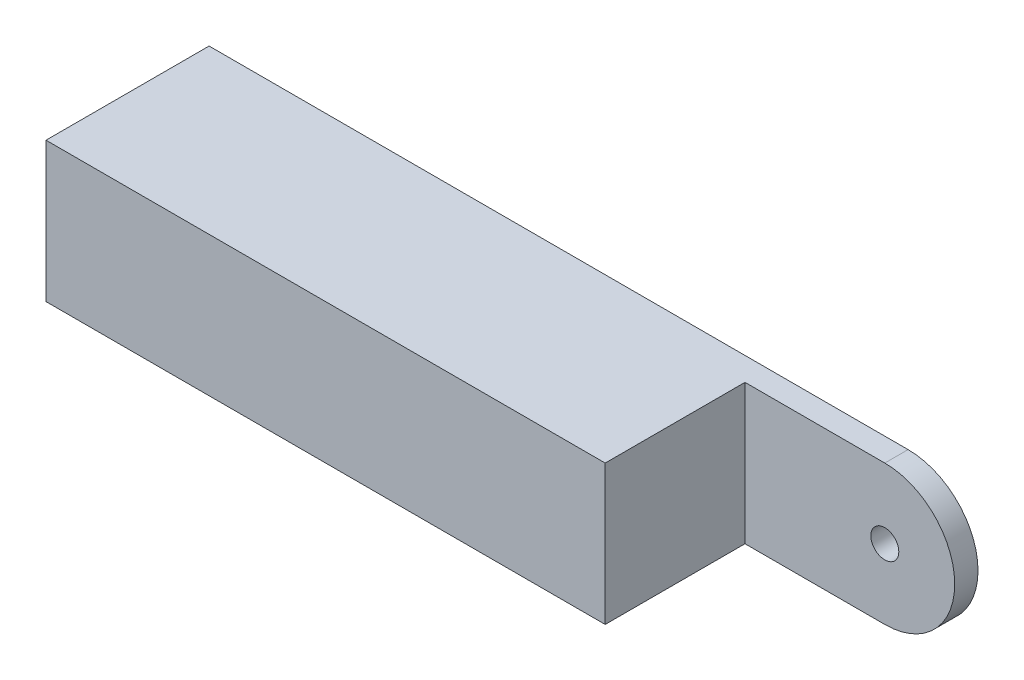
ISO-10303-21;
HEADER;
FILE_DESCRIPTION(('STEP AP214'),'2;1');
FILE_NAME('part.step','',(''),(''),'','','');
FILE_SCHEMA(('AUTOMOTIVE_DESIGN { 1 0 10303 214 1 1 1 1 }'));
ENDSEC;
DATA;
#1=APPLICATION_CONTEXT('core data for automotive mechanical design processes');
#2=APPLICATION_PROTOCOL_DEFINITION('international standard','automotive_design',2000,#1);
#3=PRODUCT_CONTEXT('',#1,'mechanical');
#4=PRODUCT('Part','Part','',(#3));
#5=PRODUCT_RELATED_PRODUCT_CATEGORY('part','',(#4));
#6=PRODUCT_DEFINITION_FORMATION('','',#4);
#7=PRODUCT_DEFINITION_CONTEXT('part definition',#1,'design');
#8=PRODUCT_DEFINITION('design','',#6,#7);
#9=PRODUCT_DEFINITION_SHAPE('','',#8);
#10=(LENGTH_UNIT() NAMED_UNIT(*) SI_UNIT(.MILLI.,.METRE.));
#11=(NAMED_UNIT(*) PLANE_ANGLE_UNIT() SI_UNIT($,.RADIAN.));
#12=(NAMED_UNIT(*) SI_UNIT($,.STERADIAN.) SOLID_ANGLE_UNIT());
#13=UNCERTAINTY_MEASURE_WITH_UNIT(LENGTH_MEASURE(1.E-05),#10,'distance_accuracy_value','');
#14=(GEOMETRIC_REPRESENTATION_CONTEXT(3) GLOBAL_UNCERTAINTY_ASSIGNED_CONTEXT((#13)) GLOBAL_UNIT_ASSIGNED_CONTEXT((#10,
#11,#12)) REPRESENTATION_CONTEXT('',''));
#15=CARTESIAN_POINT('',(0.,0.,0.));
#16=DIRECTION('',(0.,0.,1.));
#17=DIRECTION('',(1.,0.,0.));
#18=AXIS2_PLACEMENT_3D('',#15,#16,#17);
#19=CARTESIAN_POINT('',(-60.,15.,35.));
#20=DIRECTION('',(1.,0.,0.));
#21=DIRECTION('',(0.,0.,-1.));
#22=AXIS2_PLACEMENT_3D('',#19,#20,#21);
#23=PLANE('',#22);
#24=DIRECTION('',(0.,-1.,0.));
#25=VECTOR('',#24,1.);
#26=CARTESIAN_POINT('',(-60.,15.,0.));
#27=LINE('',#26,#25);
#28=CARTESIAN_POINT('',(-60.,15.,0.));
#29=VERTEX_POINT('',#28);
#30=CARTESIAN_POINT('',(-60.,-15.,0.));
#31=VERTEX_POINT('',#30);
#32=EDGE_CURVE('E191',#29,#31,#27,.T.);
#33=ORIENTED_EDGE('',*,*,#32,.T.);
#34=DIRECTION('',(0.,0.,-1.));
#35=VECTOR('',#34,1.);
#36=CARTESIAN_POINT('',(-60.,-15.,35.));
#37=LINE('',#36,#35);
#38=CARTESIAN_POINT('',(-60.,-15.,35.));
#39=VERTEX_POINT('',#38);
#40=EDGE_CURVE('E11',#39,#31,#37,.T.);
#41=ORIENTED_EDGE('',*,*,#40,.F.);
#42=DIRECTION('',(0.,-1.,0.));
#43=VECTOR('',#42,1.);
#44=CARTESIAN_POINT('',(-60.,15.,35.));
#45=LINE('',#44,#43);
#46=CARTESIAN_POINT('',(-60.,15.,35.));
#47=VERTEX_POINT('',#46);
#48=EDGE_CURVE('E198',#47,#39,#45,.T.);
#49=ORIENTED_EDGE('',*,*,#48,.F.);
#50=DIRECTION('',(0.,0.,-1.));
#51=VECTOR('',#50,1.);
#52=CARTESIAN_POINT('',(-60.,15.,35.));
#53=LINE('',#52,#51);
#54=EDGE_CURVE('E208',#47,#29,#53,.T.);
#55=ORIENTED_EDGE('',*,*,#54,.T.);
#56=EDGE_LOOP('',(#33,#41,#49,#55));
#57=FACE_BOUND('',#56,.T.);
#58=ADVANCED_FACE('F38',(#57),#23,.F.);
#59=CARTESIAN_POINT('',(-60.,-15.,35.));
#60=DIRECTION('',(0.,1.,0.));
#61=DIRECTION('',(0.,0.,1.));
#62=AXIS2_PLACEMENT_3D('',#59,#60,#61);
#63=PLANE('',#62);
#64=DIRECTION('',(1.,0.,0.));
#65=VECTOR('',#64,1.);
#66=CARTESIAN_POINT('',(-60.,-15.,0.));
#67=LINE('',#66,#65);
#68=CARTESIAN_POINT('',(90.,-15.,0.));
#69=VERTEX_POINT('',#68);
#70=EDGE_CURVE('E194',#31,#69,#67,.T.);
#71=ORIENTED_EDGE('',*,*,#70,.T.);
#72=DIRECTION('',(0.,0.,-1.));
#73=VECTOR('',#72,1.);
#74=CARTESIAN_POINT('',(90.,-15.,5.));
#75=LINE('',#74,#73);
#76=CARTESIAN_POINT('',(90.,-15.,5.));
#77=VERTEX_POINT('',#76);
#78=EDGE_CURVE('E189',#77,#69,#75,.T.);
#79=ORIENTED_EDGE('',*,*,#78,.F.);
#80=DIRECTION('',(1.,0.,0.));
#81=VECTOR('',#80,1.);
#82=CARTESIAN_POINT('',(0.,-15.,5.));
#83=LINE('',#82,#81);
#84=CARTESIAN_POINT('',(60.,-15.,5.));
#85=VERTEX_POINT('',#84);
#86=EDGE_CURVE('E168',#85,#77,#83,.T.);
#87=ORIENTED_EDGE('',*,*,#86,.F.);
#88=DIRECTION('',(0.,0.,-1.));
#89=VECTOR('',#88,1.);
#90=CARTESIAN_POINT('',(60.,-15.,35.));
#91=LINE('',#90,#89);
#92=CARTESIAN_POINT('',(60.,-15.,35.));
#93=VERTEX_POINT('',#92);
#94=EDGE_CURVE('E46',#93,#85,#91,.T.);
#95=ORIENTED_EDGE('',*,*,#94,.F.);
#96=DIRECTION('',(1.,0.,0.));
#97=VECTOR('',#96,1.);
#98=CARTESIAN_POINT('',(-60.,-15.,35.));
#99=LINE('',#98,#97);
#100=EDGE_CURVE('E201',#39,#93,#99,.T.);
#101=ORIENTED_EDGE('',*,*,#100,.F.);
#102=ORIENTED_EDGE('',*,*,#40,.T.);
#103=EDGE_LOOP('',(#71,#79,#87,#95,#101,#102));
#104=FACE_BOUND('',#103,.T.);
#105=ADVANCED_FACE('F222',(#104),#63,.F.);
#106=CARTESIAN_POINT('',(60.,15.,35.));
#107=DIRECTION('',(1.,0.,0.));
#108=DIRECTION('',(0.,1.,0.));
#109=AXIS2_PLACEMENT_3D('',#106,#107,#108);
#110=PLANE('',#109);
#111=DIRECTION('',(0.,-1.,0.));
#112=VECTOR('',#111,1.);
#113=CARTESIAN_POINT('',(60.,0.,5.));
#114=LINE('',#113,#112);
#115=CARTESIAN_POINT('',(60.,15.,5.));
#116=VERTEX_POINT('',#115);
#117=EDGE_CURVE('E62',#116,#85,#114,.T.);
#118=ORIENTED_EDGE('',*,*,#117,.F.);
#119=DIRECTION('',(0.,0.,-1.));
#120=VECTOR('',#119,1.);
#121=CARTESIAN_POINT('',(60.,15.,35.));
#122=LINE('',#121,#120);
#123=CARTESIAN_POINT('',(60.,15.,35.));
#124=VERTEX_POINT('',#123);
#125=EDGE_CURVE('E180',#124,#116,#122,.T.);
#126=ORIENTED_EDGE('',*,*,#125,.F.);
#127=DIRECTION('',(0.,-1.,0.));
#128=VECTOR('',#127,1.);
#129=CARTESIAN_POINT('',(60.,15.,35.));
#130=LINE('',#129,#128);
#131=EDGE_CURVE('E204',#124,#93,#130,.T.);
#132=ORIENTED_EDGE('',*,*,#131,.T.);
#133=ORIENTED_EDGE('',*,*,#94,.T.);
#134=EDGE_LOOP('',(#118,#126,#132,#133));
#135=FACE_BOUND('',#134,.T.);
#136=ADVANCED_FACE('F219',(#135),#110,.T.);
#137=CARTESIAN_POINT('',(-60.,15.,35.));
#138=DIRECTION('',(0.,1.,0.));
#139=DIRECTION('',(0.,0.,1.));
#140=AXIS2_PLACEMENT_3D('',#137,#138,#139);
#141=PLANE('',#140);
#142=DIRECTION('',(1.,0.,0.));
#143=VECTOR('',#142,1.);
#144=CARTESIAN_POINT('',(-60.,15.,0.));
#145=LINE('',#144,#143);
#146=CARTESIAN_POINT('',(90.,15.,0.));
#147=VERTEX_POINT('',#146);
#148=EDGE_CURVE('E202',#29,#147,#145,.T.);
#149=ORIENTED_EDGE('',*,*,#148,.F.);
#150=ORIENTED_EDGE('',*,*,#54,.F.);
#151=DIRECTION('',(1.,0.,0.));
#152=VECTOR('',#151,1.);
#153=CARTESIAN_POINT('',(-60.,15.,35.));
#154=LINE('',#153,#152);
#155=EDGE_CURVE('E207',#47,#124,#154,.T.);
#156=ORIENTED_EDGE('',*,*,#155,.T.);
#157=ORIENTED_EDGE('',*,*,#125,.T.);
#158=DIRECTION('',(1.,0.,0.));
#159=VECTOR('',#158,1.);
#160=CARTESIAN_POINT('',(0.,15.,5.));
#161=LINE('',#160,#159);
#162=CARTESIAN_POINT('',(90.,15.,5.));
#163=VERTEX_POINT('',#162);
#164=EDGE_CURVE('E162',#116,#163,#161,.T.);
#165=ORIENTED_EDGE('',*,*,#164,.T.);
#166=DIRECTION('',(0.,0.,-1.));
#167=VECTOR('',#166,1.);
#168=CARTESIAN_POINT('',(90.,15.,5.));
#169=LINE('',#168,#167);
#170=EDGE_CURVE('E177',#163,#147,#169,.T.);
#171=ORIENTED_EDGE('',*,*,#170,.T.);
#172=EDGE_LOOP('',(#149,#150,#156,#157,#165,#171));
#173=FACE_BOUND('',#172,.T.);
#174=ADVANCED_FACE('F176',(#173),#141,.T.);
#175=CARTESIAN_POINT('',(0.,0.,35.));
#176=DIRECTION('',(0.,0.,1.));
#177=DIRECTION('',(1.,0.,0.));
#178=AXIS2_PLACEMENT_3D('',#175,#176,#177);
#179=PLANE('',#178);
#180=ORIENTED_EDGE('',*,*,#48,.T.);
#181=ORIENTED_EDGE('',*,*,#100,.T.);
#182=ORIENTED_EDGE('',*,*,#131,.F.);
#183=ORIENTED_EDGE('',*,*,#155,.F.);
#184=EDGE_LOOP('',(#180,#181,#182,#183));
#185=FACE_BOUND('',#184,.T.);
#186=ADVANCED_FACE('F251',(#185),#179,.T.);
#187=CARTESIAN_POINT('',(0.,0.,0.));
#188=DIRECTION('',(0.,0.,1.));
#189=DIRECTION('',(1.,0.,0.));
#190=AXIS2_PLACEMENT_3D('',#187,#188,#189);
#191=PLANE('',#190);
#192=DIRECTION('',(-1.,0.,0.));
#193=VECTOR('',#192,1.);
#194=CARTESIAN_POINT('',(-10.,-9.88381591790135,0.));
#195=LINE('',#194,#193);
#196=CARTESIAN_POINT('',(-10.,-9.88381591790135,0.));
#197=VERTEX_POINT('',#196);
#198=CARTESIAN_POINT('',(-50.,-9.88381591790135,0.));
#199=VERTEX_POINT('',#198);
#200=EDGE_CURVE('E145',#197,#199,#195,.T.);
#201=ORIENTED_EDGE('',*,*,#200,.F.);
#202=DIRECTION('',(0.,-1.,0.));
#203=VECTOR('',#202,1.);
#204=CARTESIAN_POINT('',(-10.,10.,0.));
#205=LINE('',#204,#203);
#206=CARTESIAN_POINT('',(-10.,10.,0.));
#207=VERTEX_POINT('',#206);
#208=EDGE_CURVE('E54',#207,#197,#205,.T.);
#209=ORIENTED_EDGE('',*,*,#208,.F.);
#210=DIRECTION('',(1.,0.,0.));
#211=VECTOR('',#210,1.);
#212=CARTESIAN_POINT('',(-10.,10.,0.));
#213=LINE('',#212,#211);
#214=CARTESIAN_POINT('',(-50.,10.,0.));
#215=VERTEX_POINT('',#214);
#216=EDGE_CURVE('E136',#215,#207,#213,.T.);
#217=ORIENTED_EDGE('',*,*,#216,.F.);
#218=DIRECTION('',(0.,1.,0.));
#219=VECTOR('',#218,1.);
#220=CARTESIAN_POINT('',(-50.,10.,0.));
#221=LINE('',#220,#219);
#222=EDGE_CURVE('E139',#199,#215,#221,.T.);
#223=ORIENTED_EDGE('',*,*,#222,.F.);
#224=EDGE_LOOP('',(#201,#209,#217,#223));
#225=FACE_BOUND('',#224,.T.);
#226=ORIENTED_EDGE('',*,*,#32,.F.);
#227=ORIENTED_EDGE('',*,*,#148,.T.);
#228=CARTESIAN_POINT('',(90.,0.,0.));
#229=DIRECTION('',(0.,0.,1.));
#230=DIRECTION('',(1.,0.,0.));
#231=AXIS2_PLACEMENT_3D('',#228,#229,#230);
#232=CIRCLE('',#231,15.);
#233=EDGE_CURVE('E159',#147,#69,#232,.F.);
#234=ORIENTED_EDGE('',*,*,#233,.T.);
#235=ORIENTED_EDGE('',*,*,#70,.F.);
#236=EDGE_LOOP('',(#226,#227,#234,#235));
#237=FACE_BOUND('',#236,.T.);
#238=CARTESIAN_POINT('',(90.,0.,0.));
#239=DIRECTION('',(0.,0.,1.));
#240=DIRECTION('',(1.,0.,0.));
#241=AXIS2_PLACEMENT_3D('',#238,#239,#240);
#242=CIRCLE('',#241,3.00000000000001);
#243=CARTESIAN_POINT('',(93.,0.,0.));
#244=VERTEX_POINT('',#243);
#245=EDGE_CURVE('E151',#244,#244,#242,.T.);
#246=ORIENTED_EDGE('',*,*,#245,.T.);
#247=EDGE_LOOP('',(#246));
#248=FACE_BOUND('',#247,.T.);
#249=ADVANCED_FACE('F226',(#225,#237,#248),#191,.F.);
#250=CARTESIAN_POINT('',(90.,0.,5.));
#251=DIRECTION('',(0.,0.,-1.));
#252=DIRECTION('',(-1.,0.,0.));
#253=AXIS2_PLACEMENT_3D('',#250,#251,#252);
#254=CYLINDRICAL_SURFACE('',#253,15.);
#255=ORIENTED_EDGE('',*,*,#233,.F.);
#256=ORIENTED_EDGE('',*,*,#170,.F.);
#257=CARTESIAN_POINT('',(90.,0.,5.));
#258=DIRECTION('',(0.,0.,1.));
#259=DIRECTION('',(1.,0.,0.));
#260=AXIS2_PLACEMENT_3D('',#257,#258,#259);
#261=CIRCLE('',#260,15.);
#262=EDGE_CURVE('E158',#163,#77,#261,.F.);
#263=ORIENTED_EDGE('',*,*,#262,.T.);
#264=ORIENTED_EDGE('',*,*,#78,.T.);
#265=EDGE_LOOP('',(#255,#256,#263,#264));
#266=FACE_BOUND('',#265,.T.);
#267=ADVANCED_FACE('F188',(#266),#254,.T.);
#268=CARTESIAN_POINT('',(90.,0.,5.));
#269=DIRECTION('',(0.,0.,-1.));
#270=DIRECTION('',(-1.,0.,0.));
#271=AXIS2_PLACEMENT_3D('',#268,#269,#270);
#272=CYLINDRICAL_SURFACE('',#271,3.00000000000001);
#273=CARTESIAN_POINT('',(90.,0.,5.));
#274=DIRECTION('',(0.,0.,1.));
#275=DIRECTION('',(1.,0.,0.));
#276=AXIS2_PLACEMENT_3D('',#273,#274,#275);
#277=CIRCLE('',#276,3.00000000000001);
#278=CARTESIAN_POINT('',(93.,0.,5.));
#279=VERTEX_POINT('',#278);
#280=EDGE_CURVE('E155',#279,#279,#277,.T.);
#281=ORIENTED_EDGE('',*,*,#280,.T.);
#282=EDGE_LOOP('',(#281));
#283=FACE_BOUND('',#282,.T.);
#284=ORIENTED_EDGE('',*,*,#245,.F.);
#285=EDGE_LOOP('',(#284));
#286=FACE_BOUND('',#285,.T.);
#287=ADVANCED_FACE('F231',(#283,#286),#272,.F.);
#288=CARTESIAN_POINT('',(0.,0.,5.));
#289=DIRECTION('',(0.,0.,1.));
#290=DIRECTION('',(1.,0.,0.));
#291=AXIS2_PLACEMENT_3D('',#288,#289,#290);
#292=PLANE('',#291);
#293=ORIENTED_EDGE('',*,*,#280,.F.);
#294=EDGE_LOOP('',(#293));
#295=FACE_BOUND('',#294,.T.);
#296=ORIENTED_EDGE('',*,*,#262,.F.);
#297=ORIENTED_EDGE('',*,*,#164,.F.);
#298=ORIENTED_EDGE('',*,*,#117,.T.);
#299=ORIENTED_EDGE('',*,*,#86,.T.);
#300=EDGE_LOOP('',(#296,#297,#298,#299));
#301=FACE_BOUND('',#300,.T.);
#302=ADVANCED_FACE('F183',(#295,#301),#292,.T.);
#303=CARTESIAN_POINT('',(-10.,10.,30.));
#304=DIRECTION('',(1.,0.,0.));
#305=DIRECTION('',(0.,1.,0.));
#306=AXIS2_PLACEMENT_3D('',#303,#304,#305);
#307=PLANE('',#306);
#308=ORIENTED_EDGE('',*,*,#208,.T.);
#309=DIRECTION('',(0.,0.,-1.));
#310=VECTOR('',#309,1.);
#311=CARTESIAN_POINT('',(-10.,-9.88381591790135,30.));
#312=LINE('',#311,#310);
#313=CARTESIAN_POINT('',(-10.,-9.88381591790135,30.));
#314=VERTEX_POINT('',#313);
#315=EDGE_CURVE('E114',#314,#197,#312,.T.);
#316=ORIENTED_EDGE('',*,*,#315,.F.);
#317=DIRECTION('',(0.,-1.,0.));
#318=VECTOR('',#317,1.);
#319=CARTESIAN_POINT('',(-10.,10.,30.));
#320=LINE('',#319,#318);
#321=CARTESIAN_POINT('',(-10.,10.,30.));
#322=VERTEX_POINT('',#321);
#323=EDGE_CURVE('E118',#322,#314,#320,.T.);
#324=ORIENTED_EDGE('',*,*,#323,.F.);
#325=DIRECTION('',(0.,0.,-1.));
#326=VECTOR('',#325,1.);
#327=CARTESIAN_POINT('',(-10.,10.,30.));
#328=LINE('',#327,#326);
#329=EDGE_CURVE('E149',#322,#207,#328,.T.);
#330=ORIENTED_EDGE('',*,*,#329,.T.);
#331=EDGE_LOOP('',(#308,#316,#324,#330));
#332=FACE_BOUND('',#331,.T.);
#333=ADVANCED_FACE('F116',(#332),#307,.F.);
#334=CARTESIAN_POINT('',(-10.,10.,30.));
#335=DIRECTION('',(0.,1.,0.));
#336=DIRECTION('',(0.,0.,1.));
#337=AXIS2_PLACEMENT_3D('',#334,#335,#336);
#338=PLANE('',#337);
#339=ORIENTED_EDGE('',*,*,#216,.T.);
#340=ORIENTED_EDGE('',*,*,#329,.F.);
#341=DIRECTION('',(1.,0.,0.));
#342=VECTOR('',#341,1.);
#343=CARTESIAN_POINT('',(-10.,10.,30.));
#344=LINE('',#343,#342);
#345=CARTESIAN_POINT('',(-50.,10.,30.));
#346=VERTEX_POINT('',#345);
#347=EDGE_CURVE('E124',#346,#322,#344,.T.);
#348=ORIENTED_EDGE('',*,*,#347,.F.);
#349=DIRECTION('',(0.,0.,-1.));
#350=VECTOR('',#349,1.);
#351=CARTESIAN_POINT('',(-50.,10.,30.));
#352=LINE('',#351,#350);
#353=EDGE_CURVE('E152',#346,#215,#352,.T.);
#354=ORIENTED_EDGE('',*,*,#353,.T.);
#355=EDGE_LOOP('',(#339,#340,#348,#354));
#356=FACE_BOUND('',#355,.T.);
#357=ADVANCED_FACE('F304',(#356),#338,.F.);
#358=CARTESIAN_POINT('',(-50.,10.,30.));
#359=DIRECTION('',(-1.,0.,0.));
#360=DIRECTION('',(0.,0.,1.));
#361=AXIS2_PLACEMENT_3D('',#358,#359,#360);
#362=PLANE('',#361);
#363=ORIENTED_EDGE('',*,*,#222,.T.);
#364=ORIENTED_EDGE('',*,*,#353,.F.);
#365=DIRECTION('',(0.,1.,0.));
#366=VECTOR('',#365,1.);
#367=CARTESIAN_POINT('',(-50.,10.,30.));
#368=LINE('',#367,#366);
#369=CARTESIAN_POINT('',(-50.,-9.88381591790135,30.));
#370=VERTEX_POINT('',#369);
#371=EDGE_CURVE('E132',#370,#346,#368,.T.);
#372=ORIENTED_EDGE('',*,*,#371,.F.);
#373=DIRECTION('',(0.,0.,-1.));
#374=VECTOR('',#373,1.);
#375=CARTESIAN_POINT('',(-50.,-9.88381591790135,30.));
#376=LINE('',#375,#374);
#377=EDGE_CURVE('E123',#370,#199,#376,.T.);
#378=ORIENTED_EDGE('',*,*,#377,.T.);
#379=EDGE_LOOP('',(#363,#364,#372,#378));
#380=FACE_BOUND('',#379,.T.);
#381=ADVANCED_FACE('F313',(#380),#362,.F.);
#382=CARTESIAN_POINT('',(-10.,-9.88381591790135,30.));
#383=DIRECTION('',(0.,-1.,0.));
#384=DIRECTION('',(1.,0.,0.));
#385=AXIS2_PLACEMENT_3D('',#382,#383,#384);
#386=PLANE('',#385);
#387=ORIENTED_EDGE('',*,*,#200,.T.);
#388=ORIENTED_EDGE('',*,*,#377,.F.);
#389=DIRECTION('',(-1.,0.,0.));
#390=VECTOR('',#389,1.);
#391=CARTESIAN_POINT('',(-10.,-9.88381591790135,30.));
#392=LINE('',#391,#390);
#393=EDGE_CURVE('E127',#314,#370,#392,.T.);
#394=ORIENTED_EDGE('',*,*,#393,.F.);
#395=ORIENTED_EDGE('',*,*,#315,.T.);
#396=EDGE_LOOP('',(#387,#388,#394,#395));
#397=FACE_BOUND('',#396,.T.);
#398=ADVANCED_FACE('F128',(#397),#386,.F.);
#399=CARTESIAN_POINT('',(0.,0.,30.));
#400=DIRECTION('',(0.,0.,-1.));
#401=DIRECTION('',(-1.,0.,0.));
#402=AXIS2_PLACEMENT_3D('',#399,#400,#401);
#403=PLANE('',#402);
#404=ORIENTED_EDGE('',*,*,#323,.T.);
#405=ORIENTED_EDGE('',*,*,#393,.T.);
#406=ORIENTED_EDGE('',*,*,#371,.T.);
#407=ORIENTED_EDGE('',*,*,#347,.T.);
#408=EDGE_LOOP('',(#404,#405,#406,#407));
#409=FACE_BOUND('',#408,.T.);
#410=ADVANCED_FACE('F134',(#409),#403,.T.);
#411=CLOSED_SHELL('',(#58,#105,#136,#174,#186,#249,#267,#287,#302,#333,#357,#381,#398,#410));
#412=MANIFOLD_SOLID_BREP('B2',#411);
#413=ADVANCED_BREP_SHAPE_REPRESENTATION('',(#18,#412),#14);
#414=SHAPE_DEFINITION_REPRESENTATION(#9,#413);
ENDSEC;
END-ISO-10303-21;
